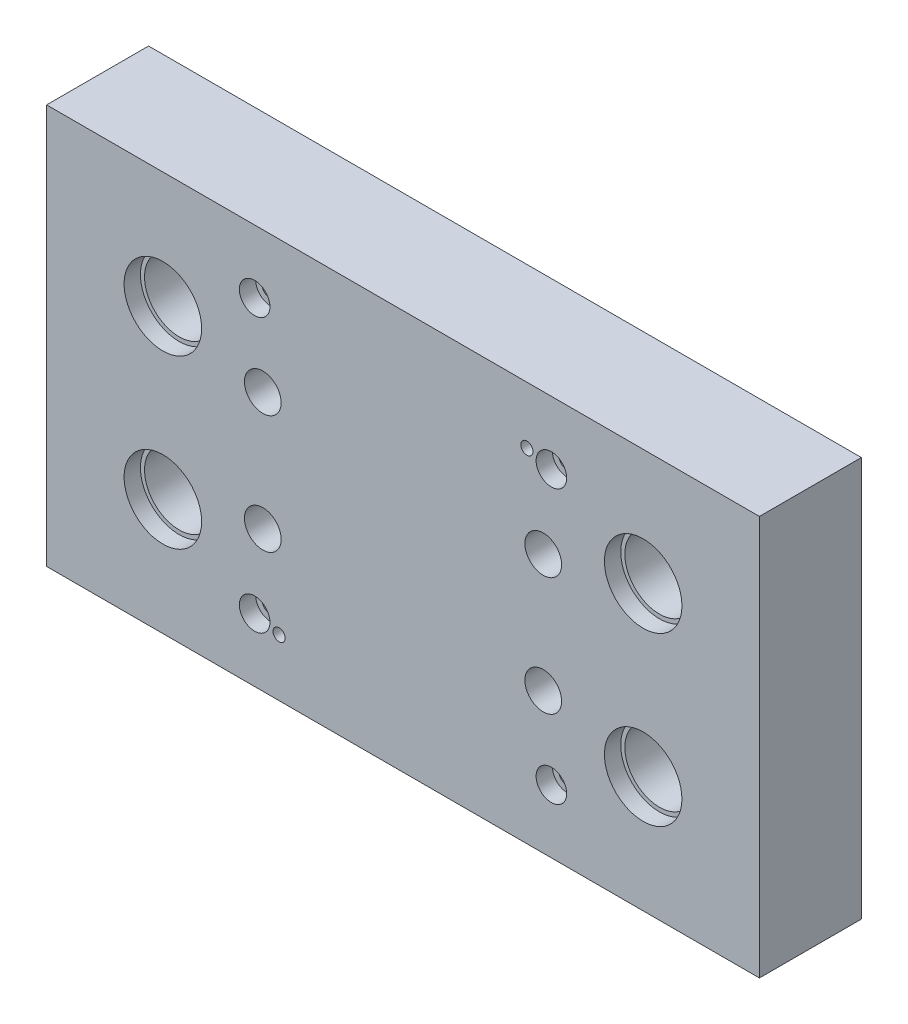
ISO-10303-21;
HEADER;
FILE_DESCRIPTION(('STEP AP214'),'2;1');
FILE_NAME('part.step','',(''),(''),'','','');
FILE_SCHEMA(('AUTOMOTIVE_DESIGN { 1 0 10303 214 1 1 1 1 }'));
ENDSEC;
DATA;
#1=APPLICATION_CONTEXT('core data for automotive mechanical design processes');
#2=APPLICATION_PROTOCOL_DEFINITION('international standard','automotive_design',2000,#1);
#3=PRODUCT_CONTEXT('',#1,'mechanical');
#4=PRODUCT('Part','Part','',(#3));
#5=PRODUCT_RELATED_PRODUCT_CATEGORY('part','',(#4));
#6=PRODUCT_DEFINITION_FORMATION('','',#4);
#7=PRODUCT_DEFINITION_CONTEXT('part definition',#1,'design');
#8=PRODUCT_DEFINITION('design','',#6,#7);
#9=PRODUCT_DEFINITION_SHAPE('','',#8);
#10=(LENGTH_UNIT() NAMED_UNIT(*) SI_UNIT(.MILLI.,.METRE.));
#11=(NAMED_UNIT(*) PLANE_ANGLE_UNIT() SI_UNIT($,.RADIAN.));
#12=(NAMED_UNIT(*) SI_UNIT($,.STERADIAN.) SOLID_ANGLE_UNIT());
#13=UNCERTAINTY_MEASURE_WITH_UNIT(LENGTH_MEASURE(1.E-05),#10,'distance_accuracy_value','');
#14=(GEOMETRIC_REPRESENTATION_CONTEXT(3) GLOBAL_UNCERTAINTY_ASSIGNED_CONTEXT((#13)) GLOBAL_UNIT_ASSIGNED_CONTEXT((#10,
#11,#12)) REPRESENTATION_CONTEXT('',''));
#15=CARTESIAN_POINT('',(0.,0.,0.));
#16=DIRECTION('',(0.,0.,1.));
#17=DIRECTION('',(1.,0.,0.));
#18=AXIS2_PLACEMENT_3D('',#15,#16,#17);
#19=CARTESIAN_POINT('',(-140.,-98.,50.));
#20=DIRECTION('',(1.,0.,0.));
#21=DIRECTION('',(0.,0.,-1.));
#22=AXIS2_PLACEMENT_3D('',#19,#20,#21);
#23=PLANE('',#22);
#24=DIRECTION('',(0.,-1.,0.));
#25=VECTOR('',#24,1.);
#26=CARTESIAN_POINT('',(-140.,-98.,0.));
#27=LINE('',#26,#25);
#28=CARTESIAN_POINT('',(-140.,98.0000000000001,0.));
#29=VERTEX_POINT('',#28);
#30=CARTESIAN_POINT('',(-140.,-98.,0.));
#31=VERTEX_POINT('',#30);
#32=EDGE_CURVE('E100',#29,#31,#27,.T.);
#33=ORIENTED_EDGE('',*,*,#32,.T.);
#34=DIRECTION('',(0.,0.,-1.));
#35=VECTOR('',#34,1.);
#36=CARTESIAN_POINT('',(-140.,-98.,50.));
#37=LINE('',#36,#35);
#38=CARTESIAN_POINT('',(-140.,-98.,50.));
#39=VERTEX_POINT('',#38);
#40=EDGE_CURVE('E11',#39,#31,#37,.T.);
#41=ORIENTED_EDGE('',*,*,#40,.F.);
#42=DIRECTION('',(0.,-1.,0.));
#43=VECTOR('',#42,1.);
#44=CARTESIAN_POINT('',(-140.,-98.,50.));
#45=LINE('',#44,#43);
#46=CARTESIAN_POINT('',(-140.,98.0000000000001,50.));
#47=VERTEX_POINT('',#46);
#48=EDGE_CURVE('E88',#47,#39,#45,.T.);
#49=ORIENTED_EDGE('',*,*,#48,.F.);
#50=DIRECTION('',(0.,0.,-1.));
#51=VECTOR('',#50,1.);
#52=CARTESIAN_POINT('',(-140.,98.0000000000001,50.));
#53=LINE('',#52,#51);
#54=EDGE_CURVE('E96',#47,#29,#53,.T.);
#55=ORIENTED_EDGE('',*,*,#54,.T.);
#56=EDGE_LOOP('',(#33,#41,#49,#55));
#57=FACE_BOUND('',#56,.T.);
#58=ADVANCED_FACE('F37',(#57),#23,.F.);
#59=CARTESIAN_POINT('',(-140.,-98.,50.));
#60=DIRECTION('',(0.,1.,0.));
#61=DIRECTION('',(0.,0.,1.));
#62=AXIS2_PLACEMENT_3D('',#59,#60,#61);
#63=PLANE('',#62);
#64=DIRECTION('',(1.,0.,0.));
#65=VECTOR('',#64,1.);
#66=CARTESIAN_POINT('',(-140.,-98.,0.));
#67=LINE('',#66,#65);
#68=CARTESIAN_POINT('',(209.5,-98.,0.));
#69=VERTEX_POINT('',#68);
#70=EDGE_CURVE('E92',#31,#69,#67,.T.);
#71=ORIENTED_EDGE('',*,*,#70,.T.);
#72=DIRECTION('',(0.,0.,-1.));
#73=VECTOR('',#72,1.);
#74=CARTESIAN_POINT('',(209.5,-98.,50.));
#75=LINE('',#74,#73);
#76=CARTESIAN_POINT('',(209.5,-98.,50.));
#77=VERTEX_POINT('',#76);
#78=EDGE_CURVE('E45',#77,#69,#75,.T.);
#79=ORIENTED_EDGE('',*,*,#78,.F.);
#80=DIRECTION('',(1.,0.,0.));
#81=VECTOR('',#80,1.);
#82=CARTESIAN_POINT('',(-140.,-98.,50.));
#83=LINE('',#82,#81);
#84=EDGE_CURVE('E83',#39,#77,#83,.T.);
#85=ORIENTED_EDGE('',*,*,#84,.F.);
#86=ORIENTED_EDGE('',*,*,#40,.T.);
#87=EDGE_LOOP('',(#71,#79,#85,#86));
#88=FACE_BOUND('',#87,.T.);
#89=ADVANCED_FACE('F91',(#88),#63,.F.);
#90=CARTESIAN_POINT('',(209.5,-98.,50.));
#91=DIRECTION('',(-1.,0.,0.));
#92=DIRECTION('',(0.,0.,1.));
#93=AXIS2_PLACEMENT_3D('',#90,#91,#92);
#94=PLANE('',#93);
#95=DIRECTION('',(0.,1.,0.));
#96=VECTOR('',#95,1.);
#97=CARTESIAN_POINT('',(209.5,-98.,0.));
#98=LINE('',#97,#96);
#99=CARTESIAN_POINT('',(209.5,98.0000000000001,0.));
#100=VERTEX_POINT('',#99);
#101=EDGE_CURVE('E70',#69,#100,#98,.T.);
#102=ORIENTED_EDGE('',*,*,#101,.T.);
#103=DIRECTION('',(0.,0.,-1.));
#104=VECTOR('',#103,1.);
#105=CARTESIAN_POINT('',(209.5,98.0000000000001,50.));
#106=LINE('',#105,#104);
#107=CARTESIAN_POINT('',(209.5,98.0000000000001,50.));
#108=VERTEX_POINT('',#107);
#109=EDGE_CURVE('E93',#108,#100,#106,.T.);
#110=ORIENTED_EDGE('',*,*,#109,.F.);
#111=DIRECTION('',(0.,1.,0.));
#112=VECTOR('',#111,1.);
#113=CARTESIAN_POINT('',(209.5,-98.,50.));
#114=LINE('',#113,#112);
#115=EDGE_CURVE('E86',#77,#108,#114,.T.);
#116=ORIENTED_EDGE('',*,*,#115,.F.);
#117=ORIENTED_EDGE('',*,*,#78,.T.);
#118=EDGE_LOOP('',(#102,#110,#116,#117));
#119=FACE_BOUND('',#118,.T.);
#120=ADVANCED_FACE('F94',(#119),#94,.F.);
#121=CARTESIAN_POINT('',(-140.,98.0000000000001,50.));
#122=DIRECTION('',(0.,-1.,0.));
#123=DIRECTION('',(0.,0.,-1.));
#124=AXIS2_PLACEMENT_3D('',#121,#122,#123);
#125=PLANE('',#124);
#126=DIRECTION('',(-1.,0.,0.));
#127=VECTOR('',#126,1.);
#128=CARTESIAN_POINT('',(-140.,98.0000000000001,0.));
#129=LINE('',#128,#127);
#130=EDGE_CURVE('E76',#100,#29,#129,.T.);
#131=ORIENTED_EDGE('',*,*,#130,.T.);
#132=ORIENTED_EDGE('',*,*,#54,.F.);
#133=DIRECTION('',(-1.,0.,0.));
#134=VECTOR('',#133,1.);
#135=CARTESIAN_POINT('',(-140.,98.0000000000001,50.));
#136=LINE('',#135,#134);
#137=EDGE_CURVE('E53',#108,#47,#136,.T.);
#138=ORIENTED_EDGE('',*,*,#137,.F.);
#139=ORIENTED_EDGE('',*,*,#109,.T.);
#140=EDGE_LOOP('',(#131,#132,#138,#139));
#141=FACE_BOUND('',#140,.T.);
#142=ADVANCED_FACE('F108',(#141),#125,.F.);
#143=CARTESIAN_POINT('',(0.,0.,50.));
#144=DIRECTION('',(0.,0.,-1.));
#145=DIRECTION('',(-1.,0.,0.));
#146=AXIS2_PLACEMENT_3D('',#143,#144,#145);
#147=PLANE('',#146);
#148=CARTESIAN_POINT('',(-83.,41.0000000000001,50.));
#149=DIRECTION('',(0.,0.,1.));
#150=DIRECTION('',(1.,0.,0.));
#151=AXIS2_PLACEMENT_3D('',#148,#149,#150);
#152=CIRCLE('',#151,19.);
#153=CARTESIAN_POINT('',(-64.,41.0000000000001,50.));
#154=VERTEX_POINT('',#153);
#155=EDGE_CURVE('E266',#154,#154,#152,.T.);
#156=ORIENTED_EDGE('',*,*,#155,.F.);
#157=EDGE_LOOP('',(#156));
#158=FACE_BOUND('',#157,.T.);
#159=CARTESIAN_POINT('',(-83.0000000000001,-41.0000000000001,50.));
#160=DIRECTION('',(0.,0.,1.));
#161=DIRECTION('',(1.,0.,0.));
#162=AXIS2_PLACEMENT_3D('',#159,#160,#161);
#163=CIRCLE('',#162,19.);
#164=CARTESIAN_POINT('',(-64.0000000000001,-41.0000000000001,50.));
#165=VERTEX_POINT('',#164);
#166=EDGE_CURVE('E254',#165,#165,#163,.T.);
#167=ORIENTED_EDGE('',*,*,#166,.F.);
#168=EDGE_LOOP('',(#167));
#169=FACE_BOUND('',#168,.T.);
#170=CARTESIAN_POINT('',(152.5,41.0000000000001,50.));
#171=DIRECTION('',(0.,0.,1.));
#172=DIRECTION('',(1.,0.,0.));
#173=AXIS2_PLACEMENT_3D('',#170,#171,#172);
#174=CIRCLE('',#173,19.);
#175=CARTESIAN_POINT('',(171.5,41.0000000000001,50.));
#176=VERTEX_POINT('',#175);
#177=EDGE_CURVE('E242',#176,#176,#174,.T.);
#178=ORIENTED_EDGE('',*,*,#177,.F.);
#179=EDGE_LOOP('',(#178));
#180=FACE_BOUND('',#179,.T.);
#181=CARTESIAN_POINT('',(152.5,-41.,50.));
#182=DIRECTION('',(0.,0.,1.));
#183=DIRECTION('',(1.,0.,0.));
#184=AXIS2_PLACEMENT_3D('',#181,#182,#183);
#185=CIRCLE('',#184,19.);
#186=CARTESIAN_POINT('',(171.5,-41.,50.));
#187=VERTEX_POINT('',#186);
#188=EDGE_CURVE('E230',#187,#187,#185,.T.);
#189=ORIENTED_EDGE('',*,*,#188,.F.);
#190=EDGE_LOOP('',(#189));
#191=FACE_BOUND('',#190,.T.);
#192=CARTESIAN_POINT('',(-34.,29.0000000000001,50.));
#193=DIRECTION('',(0.,0.,1.));
#194=DIRECTION('',(1.,0.,0.));
#195=AXIS2_PLACEMENT_3D('',#192,#193,#194);
#196=CIRCLE('',#195,9.);
#197=CARTESIAN_POINT('',(-25.,29.0000000000001,50.));
#198=VERTEX_POINT('',#197);
#199=EDGE_CURVE('E218',#198,#198,#196,.T.);
#200=ORIENTED_EDGE('',*,*,#199,.F.);
#201=EDGE_LOOP('',(#200));
#202=FACE_BOUND('',#201,.T.);
#203=CARTESIAN_POINT('',(-34.,-29.,50.));
#204=DIRECTION('',(0.,0.,1.));
#205=DIRECTION('',(1.,0.,0.));
#206=AXIS2_PLACEMENT_3D('',#203,#204,#205);
#207=CIRCLE('',#206,9.);
#208=CARTESIAN_POINT('',(-25.,-29.,50.));
#209=VERTEX_POINT('',#208);
#210=EDGE_CURVE('E206',#209,#209,#207,.T.);
#211=ORIENTED_EDGE('',*,*,#210,.F.);
#212=EDGE_LOOP('',(#211));
#213=FACE_BOUND('',#212,.T.);
#214=CARTESIAN_POINT('',(103.5,29.,50.));
#215=DIRECTION('',(0.,0.,1.));
#216=DIRECTION('',(1.,0.,0.));
#217=AXIS2_PLACEMENT_3D('',#214,#215,#216);
#218=CIRCLE('',#217,8.99999999999999);
#219=CARTESIAN_POINT('',(112.5,29.,50.));
#220=VERTEX_POINT('',#219);
#221=EDGE_CURVE('E194',#220,#220,#218,.T.);
#222=ORIENTED_EDGE('',*,*,#221,.F.);
#223=EDGE_LOOP('',(#222));
#224=FACE_BOUND('',#223,.T.);
#225=CARTESIAN_POINT('',(103.5,-29.,50.));
#226=DIRECTION('',(0.,0.,1.));
#227=DIRECTION('',(1.,0.,0.));
#228=AXIS2_PLACEMENT_3D('',#225,#226,#227);
#229=CIRCLE('',#228,8.99999999999999);
#230=CARTESIAN_POINT('',(112.5,-29.,50.));
#231=VERTEX_POINT('',#230);
#232=EDGE_CURVE('E182',#231,#231,#229,.T.);
#233=ORIENTED_EDGE('',*,*,#232,.F.);
#234=EDGE_LOOP('',(#233));
#235=FACE_BOUND('',#234,.T.);
#236=CARTESIAN_POINT('',(95.5,70.0000000000001,50.));
#237=DIRECTION('',(0.,0.,1.));
#238=DIRECTION('',(1.,0.,0.));
#239=AXIS2_PLACEMENT_3D('',#236,#237,#238);
#240=CIRCLE('',#239,2.99999999999999);
#241=CARTESIAN_POINT('',(98.5,70.0000000000001,50.));
#242=VERTEX_POINT('',#241);
#243=EDGE_CURVE('E170',#242,#242,#240,.T.);
#244=ORIENTED_EDGE('',*,*,#243,.F.);
#245=EDGE_LOOP('',(#244));
#246=FACE_BOUND('',#245,.T.);
#247=CARTESIAN_POINT('',(-26.0000000000001,-70.0000000000001,50.));
#248=DIRECTION('',(0.,0.,1.));
#249=DIRECTION('',(1.,0.,0.));
#250=AXIS2_PLACEMENT_3D('',#247,#248,#249);
#251=CIRCLE('',#250,2.99999999999999);
#252=CARTESIAN_POINT('',(-23.0000000000001,-70.0000000000001,50.));
#253=VERTEX_POINT('',#252);
#254=EDGE_CURVE('E164',#253,#253,#251,.T.);
#255=ORIENTED_EDGE('',*,*,#254,.F.);
#256=EDGE_LOOP('',(#255));
#257=FACE_BOUND('',#256,.T.);
#258=CARTESIAN_POINT('',(107.5,-67.0000000000001,50.));
#259=DIRECTION('',(0.,0.,1.));
#260=DIRECTION('',(1.,0.,0.));
#261=AXIS2_PLACEMENT_3D('',#258,#259,#260);
#262=CIRCLE('',#261,7.49999999999999);
#263=CARTESIAN_POINT('',(115.,-67.0000000000001,50.));
#264=VERTEX_POINT('',#263);
#265=EDGE_CURVE('E158',#264,#264,#262,.T.);
#266=ORIENTED_EDGE('',*,*,#265,.F.);
#267=EDGE_LOOP('',(#266));
#268=FACE_BOUND('',#267,.T.);
#269=CARTESIAN_POINT('',(107.5,67.,50.));
#270=DIRECTION('',(0.,0.,1.));
#271=DIRECTION('',(1.,0.,0.));
#272=AXIS2_PLACEMENT_3D('',#269,#270,#271);
#273=CIRCLE('',#272,7.49999999999999);
#274=CARTESIAN_POINT('',(115.,67.,50.));
#275=VERTEX_POINT('',#274);
#276=EDGE_CURVE('E146',#275,#275,#273,.T.);
#277=ORIENTED_EDGE('',*,*,#276,.F.);
#278=EDGE_LOOP('',(#277));
#279=FACE_BOUND('',#278,.T.);
#280=CARTESIAN_POINT('',(-38.0000000000001,67.0000000000001,50.));
#281=DIRECTION('',(0.,0.,1.));
#282=DIRECTION('',(1.,0.,0.));
#283=AXIS2_PLACEMENT_3D('',#280,#281,#282);
#284=CIRCLE('',#283,7.5);
#285=CARTESIAN_POINT('',(-30.5000000000001,67.0000000000001,50.));
#286=VERTEX_POINT('',#285);
#287=EDGE_CURVE('E134',#286,#286,#284,.T.);
#288=ORIENTED_EDGE('',*,*,#287,.F.);
#289=EDGE_LOOP('',(#288));
#290=FACE_BOUND('',#289,.T.);
#291=CARTESIAN_POINT('',(-38.0000000000001,-67.0000000000001,50.));
#292=DIRECTION('',(0.,0.,1.));
#293=DIRECTION('',(1.,0.,0.));
#294=AXIS2_PLACEMENT_3D('',#291,#292,#293);
#295=CIRCLE('',#294,7.5);
#296=CARTESIAN_POINT('',(-30.5000000000001,-67.0000000000001,50.));
#297=VERTEX_POINT('',#296);
#298=EDGE_CURVE('E122',#297,#297,#295,.T.);
#299=ORIENTED_EDGE('',*,*,#298,.F.);
#300=EDGE_LOOP('',(#299));
#301=FACE_BOUND('',#300,.T.);
#302=ORIENTED_EDGE('',*,*,#48,.T.);
#303=ORIENTED_EDGE('',*,*,#84,.T.);
#304=ORIENTED_EDGE('',*,*,#115,.T.);
#305=ORIENTED_EDGE('',*,*,#137,.T.);
#306=EDGE_LOOP('',(#302,#303,#304,#305));
#307=FACE_BOUND('',#306,.T.);
#308=ADVANCED_FACE('F84',(#158,#169,#180,#191,#202,#213,#224,#235,#246,#257,#268,#279,#290,#301,
#307),#147,.F.);
#309=CARTESIAN_POINT('',(0.,0.,0.));
#310=DIRECTION('',(0.,0.,-1.));
#311=DIRECTION('',(-1.,0.,0.));
#312=AXIS2_PLACEMENT_3D('',#309,#310,#311);
#313=PLANE('',#312);
#314=CARTESIAN_POINT('',(-83.,41.0000000000001,0.));
#315=DIRECTION('',(0.,0.,1.));
#316=DIRECTION('',(1.,0.,0.));
#317=AXIS2_PLACEMENT_3D('',#314,#315,#316);
#318=CIRCLE('',#317,17.);
#319=CARTESIAN_POINT('',(-66.,41.0000000000001,0.));
#320=VERTEX_POINT('',#319);
#321=EDGE_CURVE('E257',#320,#320,#318,.T.);
#322=ORIENTED_EDGE('',*,*,#321,.T.);
#323=EDGE_LOOP('',(#322));
#324=FACE_BOUND('',#323,.T.);
#325=CARTESIAN_POINT('',(-83.0000000000001,-41.0000000000001,0.));
#326=DIRECTION('',(0.,0.,1.));
#327=DIRECTION('',(1.,0.,0.));
#328=AXIS2_PLACEMENT_3D('',#325,#326,#327);
#329=CIRCLE('',#328,17.);
#330=CARTESIAN_POINT('',(-66.0000000000001,-41.0000000000001,0.));
#331=VERTEX_POINT('',#330);
#332=EDGE_CURVE('E245',#331,#331,#329,.T.);
#333=ORIENTED_EDGE('',*,*,#332,.T.);
#334=EDGE_LOOP('',(#333));
#335=FACE_BOUND('',#334,.T.);
#336=CARTESIAN_POINT('',(152.5,41.0000000000001,0.));
#337=DIRECTION('',(0.,0.,1.));
#338=DIRECTION('',(1.,0.,0.));
#339=AXIS2_PLACEMENT_3D('',#336,#337,#338);
#340=CIRCLE('',#339,17.);
#341=CARTESIAN_POINT('',(169.5,41.0000000000001,0.));
#342=VERTEX_POINT('',#341);
#343=EDGE_CURVE('E233',#342,#342,#340,.T.);
#344=ORIENTED_EDGE('',*,*,#343,.T.);
#345=EDGE_LOOP('',(#344));
#346=FACE_BOUND('',#345,.T.);
#347=CARTESIAN_POINT('',(152.5,-41.,0.));
#348=DIRECTION('',(0.,0.,1.));
#349=DIRECTION('',(1.,0.,0.));
#350=AXIS2_PLACEMENT_3D('',#347,#348,#349);
#351=CIRCLE('',#350,17.);
#352=CARTESIAN_POINT('',(169.5,-41.,0.));
#353=VERTEX_POINT('',#352);
#354=EDGE_CURVE('E221',#353,#353,#351,.T.);
#355=ORIENTED_EDGE('',*,*,#354,.T.);
#356=EDGE_LOOP('',(#355));
#357=FACE_BOUND('',#356,.T.);
#358=CARTESIAN_POINT('',(-34.,29.0000000000001,0.));
#359=DIRECTION('',(0.,0.,1.));
#360=DIRECTION('',(1.,0.,0.));
#361=AXIS2_PLACEMENT_3D('',#358,#359,#360);
#362=CIRCLE('',#361,5.49999999999999);
#363=CARTESIAN_POINT('',(-28.5,29.0000000000001,0.));
#364=VERTEX_POINT('',#363);
#365=EDGE_CURVE('E209',#364,#364,#362,.T.);
#366=ORIENTED_EDGE('',*,*,#365,.T.);
#367=EDGE_LOOP('',(#366));
#368=FACE_BOUND('',#367,.T.);
#369=CARTESIAN_POINT('',(-34.,-29.,0.));
#370=DIRECTION('',(0.,0.,1.));
#371=DIRECTION('',(1.,0.,0.));
#372=AXIS2_PLACEMENT_3D('',#369,#370,#371);
#373=CIRCLE('',#372,5.49999999999999);
#374=CARTESIAN_POINT('',(-28.5,-29.,0.));
#375=VERTEX_POINT('',#374);
#376=EDGE_CURVE('E197',#375,#375,#373,.T.);
#377=ORIENTED_EDGE('',*,*,#376,.T.);
#378=EDGE_LOOP('',(#377));
#379=FACE_BOUND('',#378,.T.);
#380=CARTESIAN_POINT('',(103.5,29.,0.));
#381=DIRECTION('',(0.,0.,1.));
#382=DIRECTION('',(1.,0.,0.));
#383=AXIS2_PLACEMENT_3D('',#380,#381,#382);
#384=CIRCLE('',#383,5.49999999999999);
#385=CARTESIAN_POINT('',(109.,29.,0.));
#386=VERTEX_POINT('',#385);
#387=EDGE_CURVE('E185',#386,#386,#384,.T.);
#388=ORIENTED_EDGE('',*,*,#387,.T.);
#389=EDGE_LOOP('',(#388));
#390=FACE_BOUND('',#389,.T.);
#391=CARTESIAN_POINT('',(103.5,-29.,0.));
#392=DIRECTION('',(0.,0.,1.));
#393=DIRECTION('',(1.,0.,0.));
#394=AXIS2_PLACEMENT_3D('',#391,#392,#393);
#395=CIRCLE('',#394,5.49999999999999);
#396=CARTESIAN_POINT('',(109.,-29.,0.));
#397=VERTEX_POINT('',#396);
#398=EDGE_CURVE('E173',#397,#397,#395,.T.);
#399=ORIENTED_EDGE('',*,*,#398,.T.);
#400=EDGE_LOOP('',(#399));
#401=FACE_BOUND('',#400,.T.);
#402=CARTESIAN_POINT('',(95.5,70.0000000000001,0.));
#403=DIRECTION('',(0.,0.,1.));
#404=DIRECTION('',(1.,0.,0.));
#405=AXIS2_PLACEMENT_3D('',#402,#403,#404);
#406=CIRCLE('',#405,2.99999999999998);
#407=CARTESIAN_POINT('',(98.5,70.0000000000001,0.));
#408=VERTEX_POINT('',#407);
#409=EDGE_CURVE('E167',#408,#408,#406,.T.);
#410=ORIENTED_EDGE('',*,*,#409,.T.);
#411=EDGE_LOOP('',(#410));
#412=FACE_BOUND('',#411,.T.);
#413=CARTESIAN_POINT('',(-26.0000000000001,-70.0000000000001,0.));
#414=DIRECTION('',(0.,0.,1.));
#415=DIRECTION('',(1.,0.,0.));
#416=AXIS2_PLACEMENT_3D('',#413,#414,#415);
#417=CIRCLE('',#416,2.99999999999998);
#418=CARTESIAN_POINT('',(-23.0000000000001,-70.0000000000001,0.));
#419=VERTEX_POINT('',#418);
#420=EDGE_CURVE('E161',#419,#419,#417,.T.);
#421=ORIENTED_EDGE('',*,*,#420,.T.);
#422=EDGE_LOOP('',(#421));
#423=FACE_BOUND('',#422,.T.);
#424=CARTESIAN_POINT('',(107.5,-67.0000000000001,0.));
#425=DIRECTION('',(0.,0.,1.));
#426=DIRECTION('',(1.,0.,0.));
#427=AXIS2_PLACEMENT_3D('',#424,#425,#426);
#428=CIRCLE('',#427,4.49999999999999);
#429=CARTESIAN_POINT('',(112.,-67.0000000000001,0.));
#430=VERTEX_POINT('',#429);
#431=EDGE_CURVE('E149',#430,#430,#428,.T.);
#432=ORIENTED_EDGE('',*,*,#431,.T.);
#433=EDGE_LOOP('',(#432));
#434=FACE_BOUND('',#433,.T.);
#435=CARTESIAN_POINT('',(107.5,67.,0.));
#436=DIRECTION('',(0.,0.,1.));
#437=DIRECTION('',(1.,0.,0.));
#438=AXIS2_PLACEMENT_3D('',#435,#436,#437);
#439=CIRCLE('',#438,4.49999999999999);
#440=CARTESIAN_POINT('',(112.,67.,0.));
#441=VERTEX_POINT('',#440);
#442=EDGE_CURVE('E137',#441,#441,#439,.T.);
#443=ORIENTED_EDGE('',*,*,#442,.T.);
#444=EDGE_LOOP('',(#443));
#445=FACE_BOUND('',#444,.T.);
#446=CARTESIAN_POINT('',(-38.0000000000001,67.0000000000001,0.));
#447=DIRECTION('',(0.,0.,1.));
#448=DIRECTION('',(1.,0.,0.));
#449=AXIS2_PLACEMENT_3D('',#446,#447,#448);
#450=CIRCLE('',#449,4.5);
#451=CARTESIAN_POINT('',(-33.5000000000001,67.0000000000001,0.));
#452=VERTEX_POINT('',#451);
#453=EDGE_CURVE('E125',#452,#452,#450,.T.);
#454=ORIENTED_EDGE('',*,*,#453,.T.);
#455=EDGE_LOOP('',(#454));
#456=FACE_BOUND('',#455,.T.);
#457=CARTESIAN_POINT('',(-38.0000000000001,-67.0000000000001,0.));
#458=DIRECTION('',(0.,0.,1.));
#459=DIRECTION('',(1.,0.,0.));
#460=AXIS2_PLACEMENT_3D('',#457,#458,#459);
#461=CIRCLE('',#460,4.5);
#462=CARTESIAN_POINT('',(-33.5000000000001,-67.0000000000001,0.));
#463=VERTEX_POINT('',#462);
#464=EDGE_CURVE('E103',#463,#463,#461,.T.);
#465=ORIENTED_EDGE('',*,*,#464,.T.);
#466=EDGE_LOOP('',(#465));
#467=FACE_BOUND('',#466,.T.);
#468=ORIENTED_EDGE('',*,*,#32,.F.);
#469=ORIENTED_EDGE('',*,*,#130,.F.);
#470=ORIENTED_EDGE('',*,*,#101,.F.);
#471=ORIENTED_EDGE('',*,*,#70,.F.);
#472=EDGE_LOOP('',(#468,#469,#470,#471));
#473=FACE_BOUND('',#472,.T.);
#474=ADVANCED_FACE('F111',(#324,#335,#346,#357,#368,#379,#390,#401,#412,#423,#434,#445,#456,
#467,#473),#313,.T.);
#475=CARTESIAN_POINT('',(-38.0000000000001,-67.0000000000001,50.));
#476=DIRECTION('',(0.,0.,1.));
#477=DIRECTION('',(1.,0.,0.));
#478=AXIS2_PLACEMENT_3D('',#475,#476,#477);
#479=CYLINDRICAL_SURFACE('',#478,4.5);
#480=ORIENTED_EDGE('',*,*,#464,.F.);
#481=EDGE_LOOP('',(#480));
#482=FACE_BOUND('',#481,.T.);
#483=CARTESIAN_POINT('',(-38.0000000000001,-67.0000000000001,42.));
#484=DIRECTION('',(0.,0.,1.));
#485=DIRECTION('',(1.,0.,0.));
#486=AXIS2_PLACEMENT_3D('',#483,#484,#485);
#487=CIRCLE('',#486,4.50000000000001);
#488=CARTESIAN_POINT('',(-33.5,-67.0000000000001,42.));
#489=VERTEX_POINT('',#488);
#490=EDGE_CURVE('E116',#489,#489,#487,.T.);
#491=ORIENTED_EDGE('',*,*,#490,.T.);
#492=EDGE_LOOP('',(#491));
#493=FACE_BOUND('',#492,.T.);
#494=ADVANCED_FACE('F314',(#482,#493),#479,.F.);
#495=CARTESIAN_POINT('',(-33.5,-67.0000000000001,42.));
#496=DIRECTION('',(0.,0.,-1.));
#497=DIRECTION('',(-1.,0.,0.));
#498=AXIS2_PLACEMENT_3D('',#495,#496,#497);
#499=PLANE('',#498);
#500=ORIENTED_EDGE('',*,*,#490,.F.);
#501=EDGE_LOOP('',(#500));
#502=FACE_BOUND('',#501,.T.);
#503=CARTESIAN_POINT('',(-38.0000000000001,-67.0000000000001,42.));
#504=DIRECTION('',(0.,0.,1.));
#505=DIRECTION('',(1.,0.,0.));
#506=AXIS2_PLACEMENT_3D('',#503,#504,#505);
#507=CIRCLE('',#506,7.5);
#508=CARTESIAN_POINT('',(-30.5000000000001,-67.0000000000001,42.));
#509=VERTEX_POINT('',#508);
#510=EDGE_CURVE('E119',#509,#509,#507,.T.);
#511=ORIENTED_EDGE('',*,*,#510,.T.);
#512=EDGE_LOOP('',(#511));
#513=FACE_BOUND('',#512,.T.);
#514=ADVANCED_FACE('F304',(#502,#513),#499,.F.);
#515=CARTESIAN_POINT('',(-38.0000000000001,-67.0000000000001,50.));
#516=DIRECTION('',(0.,0.,1.));
#517=DIRECTION('',(1.,0.,0.));
#518=AXIS2_PLACEMENT_3D('',#515,#516,#517);
#519=CYLINDRICAL_SURFACE('',#518,7.5);
#520=ORIENTED_EDGE('',*,*,#510,.F.);
#521=EDGE_LOOP('',(#520));
#522=FACE_BOUND('',#521,.T.);
#523=ORIENTED_EDGE('',*,*,#298,.T.);
#524=EDGE_LOOP('',(#523));
#525=FACE_BOUND('',#524,.T.);
#526=ADVANCED_FACE('F301',(#522,#525),#519,.F.);
#527=CARTESIAN_POINT('',(-38.0000000000001,67.0000000000001,50.));
#528=DIRECTION('',(0.,0.,1.));
#529=DIRECTION('',(1.,0.,0.));
#530=AXIS2_PLACEMENT_3D('',#527,#528,#529);
#531=CYLINDRICAL_SURFACE('',#530,4.5);
#532=ORIENTED_EDGE('',*,*,#453,.F.);
#533=EDGE_LOOP('',(#532));
#534=FACE_BOUND('',#533,.T.);
#535=CARTESIAN_POINT('',(-38.0000000000001,67.0000000000001,42.));
#536=DIRECTION('',(0.,0.,1.));
#537=DIRECTION('',(1.,0.,0.));
#538=AXIS2_PLACEMENT_3D('',#535,#536,#537);
#539=CIRCLE('',#538,4.50000000000001);
#540=CARTESIAN_POINT('',(-33.5000000000001,67.0000000000001,42.));
#541=VERTEX_POINT('',#540);
#542=EDGE_CURVE('E128',#541,#541,#539,.T.);
#543=ORIENTED_EDGE('',*,*,#542,.T.);
#544=EDGE_LOOP('',(#543));
#545=FACE_BOUND('',#544,.T.);
#546=ADVANCED_FACE('F303',(#534,#545),#531,.F.);
#547=CARTESIAN_POINT('',(-33.5000000000001,67.0000000000001,42.));
#548=DIRECTION('',(0.,0.,-1.));
#549=DIRECTION('',(-1.,0.,0.));
#550=AXIS2_PLACEMENT_3D('',#547,#548,#549);
#551=PLANE('',#550);
#552=ORIENTED_EDGE('',*,*,#542,.F.);
#553=EDGE_LOOP('',(#552));
#554=FACE_BOUND('',#553,.T.);
#555=CARTESIAN_POINT('',(-38.0000000000001,67.0000000000001,42.));
#556=DIRECTION('',(0.,0.,1.));
#557=DIRECTION('',(1.,0.,0.));
#558=AXIS2_PLACEMENT_3D('',#555,#556,#557);
#559=CIRCLE('',#558,7.5);
#560=CARTESIAN_POINT('',(-30.5000000000001,67.0000000000001,42.));
#561=VERTEX_POINT('',#560);
#562=EDGE_CURVE('E131',#561,#561,#559,.T.);
#563=ORIENTED_EDGE('',*,*,#562,.T.);
#564=EDGE_LOOP('',(#563));
#565=FACE_BOUND('',#564,.T.);
#566=ADVANCED_FACE('F311',(#554,#565),#551,.F.);
#567=CARTESIAN_POINT('',(-38.0000000000001,67.0000000000001,50.));
#568=DIRECTION('',(0.,0.,1.));
#569=DIRECTION('',(1.,0.,0.));
#570=AXIS2_PLACEMENT_3D('',#567,#568,#569);
#571=CYLINDRICAL_SURFACE('',#570,7.5);
#572=ORIENTED_EDGE('',*,*,#562,.F.);
#573=EDGE_LOOP('',(#572));
#574=FACE_BOUND('',#573,.T.);
#575=ORIENTED_EDGE('',*,*,#287,.T.);
#576=EDGE_LOOP('',(#575));
#577=FACE_BOUND('',#576,.T.);
#578=ADVANCED_FACE('F372',(#574,#577),#571,.F.);
#579=CARTESIAN_POINT('',(107.5,67.,50.));
#580=DIRECTION('',(0.,0.,1.));
#581=DIRECTION('',(1.,0.,0.));
#582=AXIS2_PLACEMENT_3D('',#579,#580,#581);
#583=CYLINDRICAL_SURFACE('',#582,4.5);
#584=ORIENTED_EDGE('',*,*,#442,.F.);
#585=EDGE_LOOP('',(#584));
#586=FACE_BOUND('',#585,.T.);
#587=CARTESIAN_POINT('',(107.5,67.,42.));
#588=DIRECTION('',(0.,0.,1.));
#589=DIRECTION('',(1.,0.,0.));
#590=AXIS2_PLACEMENT_3D('',#587,#588,#589);
#591=CIRCLE('',#590,4.50000000000002);
#592=CARTESIAN_POINT('',(112.,67.,42.));
#593=VERTEX_POINT('',#592);
#594=EDGE_CURVE('E140',#593,#593,#591,.T.);
#595=ORIENTED_EDGE('',*,*,#594,.T.);
#596=EDGE_LOOP('',(#595));
#597=FACE_BOUND('',#596,.T.);
#598=ADVANCED_FACE('F383',(#586,#597),#583,.F.);
#599=CARTESIAN_POINT('',(112.,67.,42.));
#600=DIRECTION('',(0.,0.,-1.));
#601=DIRECTION('',(-1.,0.,0.));
#602=AXIS2_PLACEMENT_3D('',#599,#600,#601);
#603=PLANE('',#602);
#604=ORIENTED_EDGE('',*,*,#594,.F.);
#605=EDGE_LOOP('',(#604));
#606=FACE_BOUND('',#605,.T.);
#607=CARTESIAN_POINT('',(107.5,67.,42.));
#608=DIRECTION('',(0.,0.,1.));
#609=DIRECTION('',(1.,0.,0.));
#610=AXIS2_PLACEMENT_3D('',#607,#608,#609);
#611=CIRCLE('',#610,7.49999999999999);
#612=CARTESIAN_POINT('',(115.,67.,42.));
#613=VERTEX_POINT('',#612);
#614=EDGE_CURVE('E143',#613,#613,#611,.T.);
#615=ORIENTED_EDGE('',*,*,#614,.T.);
#616=EDGE_LOOP('',(#615));
#617=FACE_BOUND('',#616,.T.);
#618=ADVANCED_FACE('F394',(#606,#617),#603,.F.);
#619=CARTESIAN_POINT('',(107.5,67.,50.));
#620=DIRECTION('',(0.,0.,1.));
#621=DIRECTION('',(1.,0.,0.));
#622=AXIS2_PLACEMENT_3D('',#619,#620,#621);
#623=CYLINDRICAL_SURFACE('',#622,7.49999999999999);
#624=ORIENTED_EDGE('',*,*,#614,.F.);
#625=EDGE_LOOP('',(#624));
#626=FACE_BOUND('',#625,.T.);
#627=ORIENTED_EDGE('',*,*,#276,.T.);
#628=EDGE_LOOP('',(#627));
#629=FACE_BOUND('',#628,.T.);
#630=ADVANCED_FACE('F405',(#626,#629),#623,.F.);
#631=CARTESIAN_POINT('',(107.5,-67.0000000000001,50.));
#632=DIRECTION('',(0.,0.,1.));
#633=DIRECTION('',(1.,0.,0.));
#634=AXIS2_PLACEMENT_3D('',#631,#632,#633);
#635=CYLINDRICAL_SURFACE('',#634,4.5);
#636=ORIENTED_EDGE('',*,*,#431,.F.);
#637=EDGE_LOOP('',(#636));
#638=FACE_BOUND('',#637,.T.);
#639=CARTESIAN_POINT('',(107.5,-67.0000000000001,42.));
#640=DIRECTION('',(0.,0.,1.));
#641=DIRECTION('',(1.,0.,0.));
#642=AXIS2_PLACEMENT_3D('',#639,#640,#641);
#643=CIRCLE('',#642,4.5);
#644=CARTESIAN_POINT('',(112.,-67.0000000000001,42.));
#645=VERTEX_POINT('',#644);
#646=EDGE_CURVE('E152',#645,#645,#643,.T.);
#647=ORIENTED_EDGE('',*,*,#646,.T.);
#648=EDGE_LOOP('',(#647));
#649=FACE_BOUND('',#648,.T.);
#650=ADVANCED_FACE('F416',(#638,#649),#635,.F.);
#651=CARTESIAN_POINT('',(112.,-67.0000000000001,42.));
#652=DIRECTION('',(0.,0.,-1.));
#653=DIRECTION('',(-1.,0.,0.));
#654=AXIS2_PLACEMENT_3D('',#651,#652,#653);
#655=PLANE('',#654);
#656=ORIENTED_EDGE('',*,*,#646,.F.);
#657=EDGE_LOOP('',(#656));
#658=FACE_BOUND('',#657,.T.);
#659=CARTESIAN_POINT('',(107.5,-67.0000000000001,42.));
#660=DIRECTION('',(0.,0.,1.));
#661=DIRECTION('',(1.,0.,0.));
#662=AXIS2_PLACEMENT_3D('',#659,#660,#661);
#663=CIRCLE('',#662,7.49999999999999);
#664=CARTESIAN_POINT('',(115.,-67.0000000000001,42.));
#665=VERTEX_POINT('',#664);
#666=EDGE_CURVE('E155',#665,#665,#663,.T.);
#667=ORIENTED_EDGE('',*,*,#666,.T.);
#668=EDGE_LOOP('',(#667));
#669=FACE_BOUND('',#668,.T.);
#670=ADVANCED_FACE('F427',(#658,#669),#655,.F.);
#671=CARTESIAN_POINT('',(107.5,-67.0000000000001,50.));
#672=DIRECTION('',(0.,0.,1.));
#673=DIRECTION('',(1.,0.,0.));
#674=AXIS2_PLACEMENT_3D('',#671,#672,#673);
#675=CYLINDRICAL_SURFACE('',#674,7.49999999999999);
#676=ORIENTED_EDGE('',*,*,#666,.F.);
#677=EDGE_LOOP('',(#676));
#678=FACE_BOUND('',#677,.T.);
#679=ORIENTED_EDGE('',*,*,#265,.T.);
#680=EDGE_LOOP('',(#679));
#681=FACE_BOUND('',#680,.T.);
#682=ADVANCED_FACE('F438',(#678,#681),#675,.F.);
#683=CARTESIAN_POINT('',(-26.0000000000001,-70.0000000000001,50.));
#684=DIRECTION('',(0.,0.,1.));
#685=DIRECTION('',(1.,0.,0.));
#686=AXIS2_PLACEMENT_3D('',#683,#684,#685);
#687=CYLINDRICAL_SURFACE('',#686,2.99999999999999);
#688=ORIENTED_EDGE('',*,*,#420,.F.);
#689=EDGE_LOOP('',(#688));
#690=FACE_BOUND('',#689,.T.);
#691=ORIENTED_EDGE('',*,*,#254,.T.);
#692=EDGE_LOOP('',(#691));
#693=FACE_BOUND('',#692,.T.);
#694=ADVANCED_FACE('F449',(#690,#693),#687,.F.);
#695=CARTESIAN_POINT('',(95.5,70.0000000000001,50.));
#696=DIRECTION('',(0.,0.,1.));
#697=DIRECTION('',(1.,0.,0.));
#698=AXIS2_PLACEMENT_3D('',#695,#696,#697);
#699=CYLINDRICAL_SURFACE('',#698,2.99999999999998);
#700=ORIENTED_EDGE('',*,*,#409,.F.);
#701=EDGE_LOOP('',(#700));
#702=FACE_BOUND('',#701,.T.);
#703=ORIENTED_EDGE('',*,*,#243,.T.);
#704=EDGE_LOOP('',(#703));
#705=FACE_BOUND('',#704,.T.);
#706=ADVANCED_FACE('F460',(#702,#705),#699,.F.);
#707=CARTESIAN_POINT('',(103.5,-29.,50.));
#708=DIRECTION('',(0.,0.,1.));
#709=DIRECTION('',(1.,0.,0.));
#710=AXIS2_PLACEMENT_3D('',#707,#708,#709);
#711=CYLINDRICAL_SURFACE('',#710,5.5);
#712=ORIENTED_EDGE('',*,*,#398,.F.);
#713=EDGE_LOOP('',(#712));
#714=FACE_BOUND('',#713,.T.);
#715=CARTESIAN_POINT('',(103.5,-29.,35.5));
#716=DIRECTION('',(0.,0.,1.));
#717=DIRECTION('',(1.,0.,0.));
#718=AXIS2_PLACEMENT_3D('',#715,#716,#717);
#719=CIRCLE('',#718,5.50000000000001);
#720=CARTESIAN_POINT('',(109.,-29.,35.5));
#721=VERTEX_POINT('',#720);
#722=EDGE_CURVE('E176',#721,#721,#719,.T.);
#723=ORIENTED_EDGE('',*,*,#722,.T.);
#724=EDGE_LOOP('',(#723));
#725=FACE_BOUND('',#724,.T.);
#726=ADVANCED_FACE('F471',(#714,#725),#711,.F.);
#727=CARTESIAN_POINT('',(109.,-29.,35.5));
#728=DIRECTION('',(0.,0.,-1.));
#729=DIRECTION('',(-1.,0.,0.));
#730=AXIS2_PLACEMENT_3D('',#727,#728,#729);
#731=PLANE('',#730);
#732=ORIENTED_EDGE('',*,*,#722,.F.);
#733=EDGE_LOOP('',(#732));
#734=FACE_BOUND('',#733,.T.);
#735=CARTESIAN_POINT('',(103.5,-29.,35.5));
#736=DIRECTION('',(0.,0.,1.));
#737=DIRECTION('',(1.,0.,0.));
#738=AXIS2_PLACEMENT_3D('',#735,#736,#737);
#739=CIRCLE('',#738,8.99999999999999);
#740=CARTESIAN_POINT('',(112.5,-29.,35.5));
#741=VERTEX_POINT('',#740);
#742=EDGE_CURVE('E179',#741,#741,#739,.T.);
#743=ORIENTED_EDGE('',*,*,#742,.T.);
#744=EDGE_LOOP('',(#743));
#745=FACE_BOUND('',#744,.T.);
#746=ADVANCED_FACE('F482',(#734,#745),#731,.F.);
#747=CARTESIAN_POINT('',(103.5,-29.,50.));
#748=DIRECTION('',(0.,0.,1.));
#749=DIRECTION('',(1.,0.,0.));
#750=AXIS2_PLACEMENT_3D('',#747,#748,#749);
#751=CYLINDRICAL_SURFACE('',#750,8.99999999999999);
#752=ORIENTED_EDGE('',*,*,#742,.F.);
#753=EDGE_LOOP('',(#752));
#754=FACE_BOUND('',#753,.T.);
#755=ORIENTED_EDGE('',*,*,#232,.T.);
#756=EDGE_LOOP('',(#755));
#757=FACE_BOUND('',#756,.T.);
#758=ADVANCED_FACE('F493',(#754,#757),#751,.F.);
#759=CARTESIAN_POINT('',(103.5,29.,50.));
#760=DIRECTION('',(0.,0.,1.));
#761=DIRECTION('',(1.,0.,0.));
#762=AXIS2_PLACEMENT_3D('',#759,#760,#761);
#763=CYLINDRICAL_SURFACE('',#762,5.5);
#764=ORIENTED_EDGE('',*,*,#387,.F.);
#765=EDGE_LOOP('',(#764));
#766=FACE_BOUND('',#765,.T.);
#767=CARTESIAN_POINT('',(103.5,29.,35.5));
#768=DIRECTION('',(0.,0.,1.));
#769=DIRECTION('',(1.,0.,0.));
#770=AXIS2_PLACEMENT_3D('',#767,#768,#769);
#771=CIRCLE('',#770,5.50000000000001);
#772=CARTESIAN_POINT('',(109.,29.,35.5));
#773=VERTEX_POINT('',#772);
#774=EDGE_CURVE('E188',#773,#773,#771,.T.);
#775=ORIENTED_EDGE('',*,*,#774,.T.);
#776=EDGE_LOOP('',(#775));
#777=FACE_BOUND('',#776,.T.);
#778=ADVANCED_FACE('F504',(#766,#777),#763,.F.);
#779=CARTESIAN_POINT('',(109.,29.,35.5));
#780=DIRECTION('',(0.,0.,-1.));
#781=DIRECTION('',(-1.,0.,0.));
#782=AXIS2_PLACEMENT_3D('',#779,#780,#781);
#783=PLANE('',#782);
#784=ORIENTED_EDGE('',*,*,#774,.F.);
#785=EDGE_LOOP('',(#784));
#786=FACE_BOUND('',#785,.T.);
#787=CARTESIAN_POINT('',(103.5,29.,35.5));
#788=DIRECTION('',(0.,0.,1.));
#789=DIRECTION('',(1.,0.,0.));
#790=AXIS2_PLACEMENT_3D('',#787,#788,#789);
#791=CIRCLE('',#790,9.00000000000001);
#792=CARTESIAN_POINT('',(112.5,29.,35.5));
#793=VERTEX_POINT('',#792);
#794=EDGE_CURVE('E191',#793,#793,#791,.T.);
#795=ORIENTED_EDGE('',*,*,#794,.T.);
#796=EDGE_LOOP('',(#795));
#797=FACE_BOUND('',#796,.T.);
#798=ADVANCED_FACE('F515',(#786,#797),#783,.F.);
#799=CARTESIAN_POINT('',(103.5,29.,50.));
#800=DIRECTION('',(0.,0.,1.));
#801=DIRECTION('',(1.,0.,0.));
#802=AXIS2_PLACEMENT_3D('',#799,#800,#801);
#803=CYLINDRICAL_SURFACE('',#802,9.);
#804=ORIENTED_EDGE('',*,*,#794,.F.);
#805=EDGE_LOOP('',(#804));
#806=FACE_BOUND('',#805,.T.);
#807=ORIENTED_EDGE('',*,*,#221,.T.);
#808=EDGE_LOOP('',(#807));
#809=FACE_BOUND('',#808,.T.);
#810=ADVANCED_FACE('F526',(#806,#809),#803,.F.);
#811=CARTESIAN_POINT('',(-34.,-29.,50.));
#812=DIRECTION('',(0.,0.,1.));
#813=DIRECTION('',(1.,0.,0.));
#814=AXIS2_PLACEMENT_3D('',#811,#812,#813);
#815=CYLINDRICAL_SURFACE('',#814,5.5);
#816=ORIENTED_EDGE('',*,*,#376,.F.);
#817=EDGE_LOOP('',(#816));
#818=FACE_BOUND('',#817,.T.);
#819=CARTESIAN_POINT('',(-34.,-29.,35.5));
#820=DIRECTION('',(0.,0.,1.));
#821=DIRECTION('',(1.,0.,0.));
#822=AXIS2_PLACEMENT_3D('',#819,#820,#821);
#823=CIRCLE('',#822,5.5);
#824=CARTESIAN_POINT('',(-28.5,-29.,35.5));
#825=VERTEX_POINT('',#824);
#826=EDGE_CURVE('E200',#825,#825,#823,.T.);
#827=ORIENTED_EDGE('',*,*,#826,.T.);
#828=EDGE_LOOP('',(#827));
#829=FACE_BOUND('',#828,.T.);
#830=ADVANCED_FACE('F537',(#818,#829),#815,.F.);
#831=CARTESIAN_POINT('',(-28.5,-29.,35.5));
#832=DIRECTION('',(0.,0.,-1.));
#833=DIRECTION('',(-1.,0.,0.));
#834=AXIS2_PLACEMENT_3D('',#831,#832,#833);
#835=PLANE('',#834);
#836=ORIENTED_EDGE('',*,*,#826,.F.);
#837=EDGE_LOOP('',(#836));
#838=FACE_BOUND('',#837,.T.);
#839=CARTESIAN_POINT('',(-34.,-29.,35.5));
#840=DIRECTION('',(0.,0.,1.));
#841=DIRECTION('',(1.,0.,0.));
#842=AXIS2_PLACEMENT_3D('',#839,#840,#841);
#843=CIRCLE('',#842,9.);
#844=CARTESIAN_POINT('',(-25.,-29.,35.5));
#845=VERTEX_POINT('',#844);
#846=EDGE_CURVE('E203',#845,#845,#843,.T.);
#847=ORIENTED_EDGE('',*,*,#846,.T.);
#848=EDGE_LOOP('',(#847));
#849=FACE_BOUND('',#848,.T.);
#850=ADVANCED_FACE('F548',(#838,#849),#835,.F.);
#851=CARTESIAN_POINT('',(-34.,-29.,50.));
#852=DIRECTION('',(0.,0.,1.));
#853=DIRECTION('',(1.,0.,0.));
#854=AXIS2_PLACEMENT_3D('',#851,#852,#853);
#855=CYLINDRICAL_SURFACE('',#854,9.);
#856=ORIENTED_EDGE('',*,*,#846,.F.);
#857=EDGE_LOOP('',(#856));
#858=FACE_BOUND('',#857,.T.);
#859=ORIENTED_EDGE('',*,*,#210,.T.);
#860=EDGE_LOOP('',(#859));
#861=FACE_BOUND('',#860,.T.);
#862=ADVANCED_FACE('F559',(#858,#861),#855,.F.);
#863=CARTESIAN_POINT('',(-34.,29.0000000000001,50.));
#864=DIRECTION('',(0.,0.,1.));
#865=DIRECTION('',(1.,0.,0.));
#866=AXIS2_PLACEMENT_3D('',#863,#864,#865);
#867=CYLINDRICAL_SURFACE('',#866,5.5);
#868=ORIENTED_EDGE('',*,*,#365,.F.);
#869=EDGE_LOOP('',(#868));
#870=FACE_BOUND('',#869,.T.);
#871=CARTESIAN_POINT('',(-34.,29.0000000000001,35.5));
#872=DIRECTION('',(0.,0.,1.));
#873=DIRECTION('',(1.,0.,0.));
#874=AXIS2_PLACEMENT_3D('',#871,#872,#873);
#875=CIRCLE('',#874,5.5);
#876=CARTESIAN_POINT('',(-28.5,29.0000000000001,35.5));
#877=VERTEX_POINT('',#876);
#878=EDGE_CURVE('E212',#877,#877,#875,.T.);
#879=ORIENTED_EDGE('',*,*,#878,.T.);
#880=EDGE_LOOP('',(#879));
#881=FACE_BOUND('',#880,.T.);
#882=ADVANCED_FACE('F570',(#870,#881),#867,.F.);
#883=CARTESIAN_POINT('',(-28.5,29.0000000000001,35.5));
#884=DIRECTION('',(0.,0.,-1.));
#885=DIRECTION('',(-1.,0.,0.));
#886=AXIS2_PLACEMENT_3D('',#883,#884,#885);
#887=PLANE('',#886);
#888=ORIENTED_EDGE('',*,*,#878,.F.);
#889=EDGE_LOOP('',(#888));
#890=FACE_BOUND('',#889,.T.);
#891=CARTESIAN_POINT('',(-34.,29.0000000000001,35.5));
#892=DIRECTION('',(0.,0.,1.));
#893=DIRECTION('',(1.,0.,0.));
#894=AXIS2_PLACEMENT_3D('',#891,#892,#893);
#895=CIRCLE('',#894,9.);
#896=CARTESIAN_POINT('',(-25.,29.0000000000001,35.5));
#897=VERTEX_POINT('',#896);
#898=EDGE_CURVE('E215',#897,#897,#895,.T.);
#899=ORIENTED_EDGE('',*,*,#898,.T.);
#900=EDGE_LOOP('',(#899));
#901=FACE_BOUND('',#900,.T.);
#902=ADVANCED_FACE('F581',(#890,#901),#887,.F.);
#903=CARTESIAN_POINT('',(-34.,29.0000000000001,50.));
#904=DIRECTION('',(0.,0.,1.));
#905=DIRECTION('',(1.,0.,0.));
#906=AXIS2_PLACEMENT_3D('',#903,#904,#905);
#907=CYLINDRICAL_SURFACE('',#906,9.);
#908=ORIENTED_EDGE('',*,*,#898,.F.);
#909=EDGE_LOOP('',(#908));
#910=FACE_BOUND('',#909,.T.);
#911=ORIENTED_EDGE('',*,*,#199,.T.);
#912=EDGE_LOOP('',(#911));
#913=FACE_BOUND('',#912,.T.);
#914=ADVANCED_FACE('F592',(#910,#913),#907,.F.);
#915=CARTESIAN_POINT('',(152.5,-41.,50.));
#916=DIRECTION('',(0.,0.,1.));
#917=DIRECTION('',(1.,0.,0.));
#918=AXIS2_PLACEMENT_3D('',#915,#916,#917);
#919=CYLINDRICAL_SURFACE('',#918,17.);
#920=ORIENTED_EDGE('',*,*,#354,.F.);
#921=EDGE_LOOP('',(#920));
#922=FACE_BOUND('',#921,.T.);
#923=CARTESIAN_POINT('',(152.5,-41.,42.));
#924=DIRECTION('',(0.,0.,1.));
#925=DIRECTION('',(1.,0.,0.));
#926=AXIS2_PLACEMENT_3D('',#923,#924,#925);
#927=CIRCLE('',#926,17.);
#928=CARTESIAN_POINT('',(169.5,-41.,42.));
#929=VERTEX_POINT('',#928);
#930=EDGE_CURVE('E224',#929,#929,#927,.T.);
#931=ORIENTED_EDGE('',*,*,#930,.T.);
#932=EDGE_LOOP('',(#931));
#933=FACE_BOUND('',#932,.T.);
#934=ADVANCED_FACE('F602',(#922,#933),#919,.F.);
#935=CARTESIAN_POINT('',(169.5,-41.,42.));
#936=DIRECTION('',(0.,0.,-1.));
#937=DIRECTION('',(-1.,0.,0.));
#938=AXIS2_PLACEMENT_3D('',#935,#936,#937);
#939=PLANE('',#938);
#940=ORIENTED_EDGE('',*,*,#930,.F.);
#941=EDGE_LOOP('',(#940));
#942=FACE_BOUND('',#941,.T.);
#943=CARTESIAN_POINT('',(152.5,-41.,42.));
#944=DIRECTION('',(0.,0.,1.));
#945=DIRECTION('',(1.,0.,0.));
#946=AXIS2_PLACEMENT_3D('',#943,#944,#945);
#947=CIRCLE('',#946,19.);
#948=CARTESIAN_POINT('',(171.5,-41.,42.));
#949=VERTEX_POINT('',#948);
#950=EDGE_CURVE('E227',#949,#949,#947,.T.);
#951=ORIENTED_EDGE('',*,*,#950,.T.);
#952=EDGE_LOOP('',(#951));
#953=FACE_BOUND('',#952,.T.);
#954=ADVANCED_FACE('F618',(#942,#953),#939,.F.);
#955=CARTESIAN_POINT('',(152.5,-41.,50.));
#956=DIRECTION('',(0.,0.,1.));
#957=DIRECTION('',(1.,0.,0.));
#958=AXIS2_PLACEMENT_3D('',#955,#956,#957);
#959=CYLINDRICAL_SURFACE('',#958,19.);
#960=ORIENTED_EDGE('',*,*,#950,.F.);
#961=EDGE_LOOP('',(#960));
#962=FACE_BOUND('',#961,.T.);
#963=ORIENTED_EDGE('',*,*,#188,.T.);
#964=EDGE_LOOP('',(#963));
#965=FACE_BOUND('',#964,.T.);
#966=ADVANCED_FACE('F629',(#962,#965),#959,.F.);
#967=CARTESIAN_POINT('',(152.5,41.0000000000001,50.));
#968=DIRECTION('',(0.,0.,1.));
#969=DIRECTION('',(1.,0.,0.));
#970=AXIS2_PLACEMENT_3D('',#967,#968,#969);
#971=CYLINDRICAL_SURFACE('',#970,17.);
#972=ORIENTED_EDGE('',*,*,#343,.F.);
#973=EDGE_LOOP('',(#972));
#974=FACE_BOUND('',#973,.T.);
#975=CARTESIAN_POINT('',(152.5,41.0000000000001,42.));
#976=DIRECTION('',(0.,0.,1.));
#977=DIRECTION('',(1.,0.,0.));
#978=AXIS2_PLACEMENT_3D('',#975,#976,#977);
#979=CIRCLE('',#978,17.);
#980=CARTESIAN_POINT('',(169.5,41.0000000000001,42.));
#981=VERTEX_POINT('',#980);
#982=EDGE_CURVE('E236',#981,#981,#979,.T.);
#983=ORIENTED_EDGE('',*,*,#982,.T.);
#984=EDGE_LOOP('',(#983));
#985=FACE_BOUND('',#984,.T.);
#986=ADVANCED_FACE('F640',(#974,#985),#971,.F.);
#987=CARTESIAN_POINT('',(169.5,41.0000000000001,42.));
#988=DIRECTION('',(0.,0.,-1.));
#989=DIRECTION('',(-1.,0.,0.));
#990=AXIS2_PLACEMENT_3D('',#987,#988,#989);
#991=PLANE('',#990);
#992=ORIENTED_EDGE('',*,*,#982,.F.);
#993=EDGE_LOOP('',(#992));
#994=FACE_BOUND('',#993,.T.);
#995=CARTESIAN_POINT('',(152.5,41.0000000000001,42.));
#996=DIRECTION('',(0.,0.,1.));
#997=DIRECTION('',(1.,0.,0.));
#998=AXIS2_PLACEMENT_3D('',#995,#996,#997);
#999=CIRCLE('',#998,19.);
#1000=CARTESIAN_POINT('',(171.5,41.0000000000001,42.));
#1001=VERTEX_POINT('',#1000);
#1002=EDGE_CURVE('E239',#1001,#1001,#999,.T.);
#1003=ORIENTED_EDGE('',*,*,#1002,.T.);
#1004=EDGE_LOOP('',(#1003));
#1005=FACE_BOUND('',#1004,.T.);
#1006=ADVANCED_FACE('F651',(#994,#1005),#991,.F.);
#1007=CARTESIAN_POINT('',(152.5,41.0000000000001,50.));
#1008=DIRECTION('',(0.,0.,1.));
#1009=DIRECTION('',(1.,0.,0.));
#1010=AXIS2_PLACEMENT_3D('',#1007,#1008,#1009);
#1011=CYLINDRICAL_SURFACE('',#1010,19.);
#1012=ORIENTED_EDGE('',*,*,#1002,.F.);
#1013=EDGE_LOOP('',(#1012));
#1014=FACE_BOUND('',#1013,.T.);
#1015=ORIENTED_EDGE('',*,*,#177,.T.);
#1016=EDGE_LOOP('',(#1015));
#1017=FACE_BOUND('',#1016,.T.);
#1018=ADVANCED_FACE('F662',(#1014,#1017),#1011,.F.);
#1019=CARTESIAN_POINT('',(-83.0000000000001,-41.0000000000001,50.));
#1020=DIRECTION('',(0.,0.,1.));
#1021=DIRECTION('',(1.,0.,0.));
#1022=AXIS2_PLACEMENT_3D('',#1019,#1020,#1021);
#1023=CYLINDRICAL_SURFACE('',#1022,17.);
#1024=ORIENTED_EDGE('',*,*,#332,.F.);
#1025=EDGE_LOOP('',(#1024));
#1026=FACE_BOUND('',#1025,.T.);
#1027=CARTESIAN_POINT('',(-83.0000000000001,-41.0000000000001,42.));
#1028=DIRECTION('',(0.,0.,1.));
#1029=DIRECTION('',(1.,0.,0.));
#1030=AXIS2_PLACEMENT_3D('',#1027,#1028,#1029);
#1031=CIRCLE('',#1030,17.);
#1032=CARTESIAN_POINT('',(-66.0000000000001,-41.0000000000001,42.));
#1033=VERTEX_POINT('',#1032);
#1034=EDGE_CURVE('E248',#1033,#1033,#1031,.T.);
#1035=ORIENTED_EDGE('',*,*,#1034,.T.);
#1036=EDGE_LOOP('',(#1035));
#1037=FACE_BOUND('',#1036,.T.);
#1038=ADVANCED_FACE('F673',(#1026,#1037),#1023,.F.);
#1039=CARTESIAN_POINT('',(-66.0000000000001,-41.0000000000001,42.));
#1040=DIRECTION('',(0.,0.,-1.));
#1041=DIRECTION('',(-1.,0.,0.));
#1042=AXIS2_PLACEMENT_3D('',#1039,#1040,#1041);
#1043=PLANE('',#1042);
#1044=ORIENTED_EDGE('',*,*,#1034,.F.);
#1045=EDGE_LOOP('',(#1044));
#1046=FACE_BOUND('',#1045,.T.);
#1047=CARTESIAN_POINT('',(-83.0000000000001,-41.0000000000001,42.));
#1048=DIRECTION('',(0.,0.,1.));
#1049=DIRECTION('',(1.,0.,0.));
#1050=AXIS2_PLACEMENT_3D('',#1047,#1048,#1049);
#1051=CIRCLE('',#1050,19.);
#1052=CARTESIAN_POINT('',(-64.0000000000001,-41.0000000000001,42.));
#1053=VERTEX_POINT('',#1052);
#1054=EDGE_CURVE('E251',#1053,#1053,#1051,.T.);
#1055=ORIENTED_EDGE('',*,*,#1054,.T.);
#1056=EDGE_LOOP('',(#1055));
#1057=FACE_BOUND('',#1056,.T.);
#1058=ADVANCED_FACE('F684',(#1046,#1057),#1043,.F.);
#1059=CARTESIAN_POINT('',(-83.0000000000001,-41.0000000000001,50.));
#1060=DIRECTION('',(0.,0.,1.));
#1061=DIRECTION('',(1.,0.,0.));
#1062=AXIS2_PLACEMENT_3D('',#1059,#1060,#1061);
#1063=CYLINDRICAL_SURFACE('',#1062,19.);
#1064=ORIENTED_EDGE('',*,*,#1054,.F.);
#1065=EDGE_LOOP('',(#1064));
#1066=FACE_BOUND('',#1065,.T.);
#1067=ORIENTED_EDGE('',*,*,#166,.T.);
#1068=EDGE_LOOP('',(#1067));
#1069=FACE_BOUND('',#1068,.T.);
#1070=ADVANCED_FACE('F695',(#1066,#1069),#1063,.F.);
#1071=CARTESIAN_POINT('',(-83.,41.0000000000001,50.));
#1072=DIRECTION('',(0.,0.,1.));
#1073=DIRECTION('',(1.,0.,0.));
#1074=AXIS2_PLACEMENT_3D('',#1071,#1072,#1073);
#1075=CYLINDRICAL_SURFACE('',#1074,17.);
#1076=ORIENTED_EDGE('',*,*,#321,.F.);
#1077=EDGE_LOOP('',(#1076));
#1078=FACE_BOUND('',#1077,.T.);
#1079=CARTESIAN_POINT('',(-83.,41.0000000000001,42.));
#1080=DIRECTION('',(0.,0.,1.));
#1081=DIRECTION('',(1.,0.,0.));
#1082=AXIS2_PLACEMENT_3D('',#1079,#1080,#1081);
#1083=CIRCLE('',#1082,17.);
#1084=CARTESIAN_POINT('',(-66.,41.0000000000001,42.));
#1085=VERTEX_POINT('',#1084);
#1086=EDGE_CURVE('E260',#1085,#1085,#1083,.T.);
#1087=ORIENTED_EDGE('',*,*,#1086,.T.);
#1088=EDGE_LOOP('',(#1087));
#1089=FACE_BOUND('',#1088,.T.);
#1090=ADVANCED_FACE('F706',(#1078,#1089),#1075,.F.);
#1091=CARTESIAN_POINT('',(-66.,41.0000000000001,42.));
#1092=DIRECTION('',(0.,0.,-1.));
#1093=DIRECTION('',(-1.,0.,0.));
#1094=AXIS2_PLACEMENT_3D('',#1091,#1092,#1093);
#1095=PLANE('',#1094);
#1096=ORIENTED_EDGE('',*,*,#1086,.F.);
#1097=EDGE_LOOP('',(#1096));
#1098=FACE_BOUND('',#1097,.T.);
#1099=CARTESIAN_POINT('',(-83.,41.0000000000001,42.));
#1100=DIRECTION('',(0.,0.,1.));
#1101=DIRECTION('',(1.,0.,0.));
#1102=AXIS2_PLACEMENT_3D('',#1099,#1100,#1101);
#1103=CIRCLE('',#1102,19.);
#1104=CARTESIAN_POINT('',(-64.,41.0000000000001,42.));
#1105=VERTEX_POINT('',#1104);
#1106=EDGE_CURVE('E263',#1105,#1105,#1103,.T.);
#1107=ORIENTED_EDGE('',*,*,#1106,.T.);
#1108=EDGE_LOOP('',(#1107));
#1109=FACE_BOUND('',#1108,.T.);
#1110=ADVANCED_FACE('F717',(#1098,#1109),#1095,.F.);
#1111=CARTESIAN_POINT('',(-83.,41.0000000000001,50.));
#1112=DIRECTION('',(0.,0.,1.));
#1113=DIRECTION('',(1.,0.,0.));
#1114=AXIS2_PLACEMENT_3D('',#1111,#1112,#1113);
#1115=CYLINDRICAL_SURFACE('',#1114,19.);
#1116=ORIENTED_EDGE('',*,*,#1106,.F.);
#1117=EDGE_LOOP('',(#1116));
#1118=FACE_BOUND('',#1117,.T.);
#1119=ORIENTED_EDGE('',*,*,#155,.T.);
#1120=EDGE_LOOP('',(#1119));
#1121=FACE_BOUND('',#1120,.T.);
#1122=ADVANCED_FACE('F270',(#1118,#1121),#1115,.F.);
#1123=CLOSED_SHELL('',(#58,#89,#120,#142,#308,#474,#494,#514,#526,#546,#566,#578,#598,#618,#630,
#650,#670,#682,#694,#706,#726,#746,#758,#778,#798,#810,#830,#850,#862,#882,#902,#914,#934,#954,
#966,#986,#1006,#1018,#1038,#1058,#1070,#1090,#1110,#1122));
#1124=MANIFOLD_SOLID_BREP('B2',#1123);
#1125=ADVANCED_BREP_SHAPE_REPRESENTATION('',(#18,#1124),#14);
#1126=SHAPE_DEFINITION_REPRESENTATION(#9,#1125);
ENDSEC;
END-ISO-10303-21;
